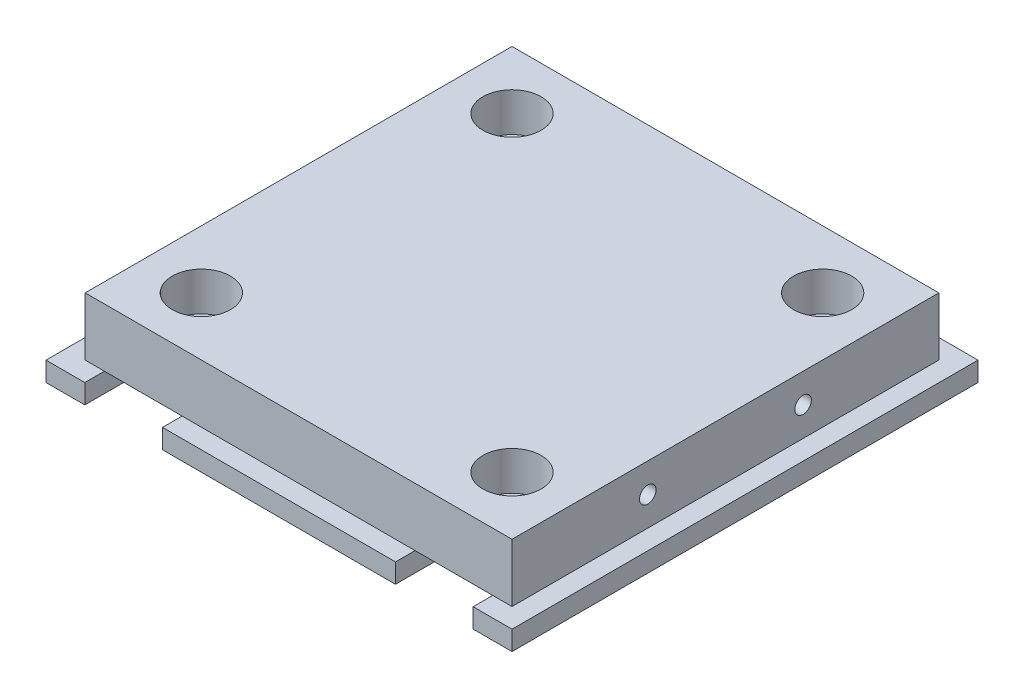
ISO-10303-21;
HEADER;
FILE_DESCRIPTION(('STEP AP214'),'2;1');
FILE_NAME('part.step','',(''),(''),'','','');
FILE_SCHEMA(('AUTOMOTIVE_DESIGN { 1 0 10303 214 1 1 1 1 }'));
ENDSEC;
DATA;
#1=APPLICATION_CONTEXT('core data for automotive mechanical design processes');
#2=APPLICATION_PROTOCOL_DEFINITION('international standard','automotive_design',2000,#1);
#3=PRODUCT_CONTEXT('',#1,'mechanical');
#4=PRODUCT('Part','Part','',(#3));
#5=PRODUCT_RELATED_PRODUCT_CATEGORY('part','',(#4));
#6=PRODUCT_DEFINITION_FORMATION('','',#4);
#7=PRODUCT_DEFINITION_CONTEXT('part definition',#1,'design');
#8=PRODUCT_DEFINITION('design','',#6,#7);
#9=PRODUCT_DEFINITION_SHAPE('','',#8);
#10=(LENGTH_UNIT() NAMED_UNIT(*) SI_UNIT(.MILLI.,.METRE.));
#11=(NAMED_UNIT(*) PLANE_ANGLE_UNIT() SI_UNIT($,.RADIAN.));
#12=(NAMED_UNIT(*) SI_UNIT($,.STERADIAN.) SOLID_ANGLE_UNIT());
#13=UNCERTAINTY_MEASURE_WITH_UNIT(LENGTH_MEASURE(1.E-05),#10,'distance_accuracy_value','');
#14=(GEOMETRIC_REPRESENTATION_CONTEXT(3) GLOBAL_UNCERTAINTY_ASSIGNED_CONTEXT((#13)) GLOBAL_UNIT_ASSIGNED_CONTEXT((#10,
#11,#12)) REPRESENTATION_CONTEXT('',''));
#15=CARTESIAN_POINT('',(0.,0.,0.));
#16=DIRECTION('',(0.,0.,1.));
#17=DIRECTION('',(1.,0.,0.));
#18=AXIS2_PLACEMENT_3D('',#15,#16,#17);
#19=CARTESIAN_POINT('',(-25.4,12.7,25.4));
#20=DIRECTION('',(0.,-1.,0.));
#21=DIRECTION('',(0.,0.,-1.));
#22=AXIS2_PLACEMENT_3D('',#19,#20,#21);
#23=CYLINDRICAL_SURFACE('',#22,2.5527);
#24=CARTESIAN_POINT('',(-25.4,3.175,25.4));
#25=DIRECTION('',(0.,-1.,0.));
#26=DIRECTION('',(0.,0.,-1.));
#27=AXIS2_PLACEMENT_3D('',#24,#25,#26);
#28=CIRCLE('',#27,2.5527);
#29=CARTESIAN_POINT('',(-25.4,3.175,22.8473));
#30=VERTEX_POINT('',#29);
#31=EDGE_CURVE('E286',#30,#30,#28,.T.);
#32=ORIENTED_EDGE('',*,*,#31,.T.);
#33=EDGE_LOOP('',(#32));
#34=FACE_BOUND('',#33,.T.);
#35=CARTESIAN_POINT('',(-25.4,6.35,25.4));
#36=DIRECTION('',(0.,1.,0.));
#37=DIRECTION('',(0.,0.,1.));
#38=AXIS2_PLACEMENT_3D('',#35,#36,#37);
#39=CIRCLE('',#38,2.5527);
#40=CARTESIAN_POINT('',(-25.4,6.35,27.9527));
#41=VERTEX_POINT('',#40);
#42=EDGE_CURVE('E41',#41,#41,#39,.F.);
#43=ORIENTED_EDGE('',*,*,#42,.F.);
#44=EDGE_LOOP('',(#43));
#45=FACE_BOUND('',#44,.T.);
#46=ADVANCED_FACE('F37',(#34,#45),#23,.F.);
#47=CARTESIAN_POINT('',(25.4,12.7,25.4));
#48=DIRECTION('',(0.,-1.,0.));
#49=DIRECTION('',(0.,0.,-1.));
#50=AXIS2_PLACEMENT_3D('',#47,#48,#49);
#51=CYLINDRICAL_SURFACE('',#50,2.5527);
#52=CARTESIAN_POINT('',(25.4,3.175,25.4));
#53=DIRECTION('',(0.,-1.,0.));
#54=DIRECTION('',(0.,0.,-1.));
#55=AXIS2_PLACEMENT_3D('',#52,#53,#54);
#56=CIRCLE('',#55,2.5527);
#57=CARTESIAN_POINT('',(25.4,3.175,22.8473));
#58=VERTEX_POINT('',#57);
#59=EDGE_CURVE('E283',#58,#58,#56,.T.);
#60=ORIENTED_EDGE('',*,*,#59,.T.);
#61=EDGE_LOOP('',(#60));
#62=FACE_BOUND('',#61,.T.);
#63=CARTESIAN_POINT('',(25.4,6.35,25.4));
#64=DIRECTION('',(0.,1.,0.));
#65=DIRECTION('',(0.,0.,1.));
#66=AXIS2_PLACEMENT_3D('',#63,#64,#65);
#67=CIRCLE('',#66,2.5527);
#68=CARTESIAN_POINT('',(25.4,6.35,27.9527));
#69=VERTEX_POINT('',#68);
#70=EDGE_CURVE('E253',#69,#69,#67,.F.);
#71=ORIENTED_EDGE('',*,*,#70,.F.);
#72=EDGE_LOOP('',(#71));
#73=FACE_BOUND('',#72,.T.);
#74=ADVANCED_FACE('F497',(#62,#73),#51,.F.);
#75=CARTESIAN_POINT('',(25.4,12.7,-25.4));
#76=DIRECTION('',(0.,-1.,0.));
#77=DIRECTION('',(0.,0.,-1.));
#78=AXIS2_PLACEMENT_3D('',#75,#76,#77);
#79=CYLINDRICAL_SURFACE('',#78,2.5527);
#80=CARTESIAN_POINT('',(25.4,3.175,-25.4));
#81=DIRECTION('',(0.,-1.,0.));
#82=DIRECTION('',(0.,0.,-1.));
#83=AXIS2_PLACEMENT_3D('',#80,#81,#82);
#84=CIRCLE('',#83,2.5527);
#85=CARTESIAN_POINT('',(25.4,3.175,-27.9527));
#86=VERTEX_POINT('',#85);
#87=EDGE_CURVE('E280',#86,#86,#84,.T.);
#88=ORIENTED_EDGE('',*,*,#87,.T.);
#89=EDGE_LOOP('',(#88));
#90=FACE_BOUND('',#89,.T.);
#91=CARTESIAN_POINT('',(25.4,6.35,-25.4));
#92=DIRECTION('',(0.,1.,0.));
#93=DIRECTION('',(0.,0.,1.));
#94=AXIS2_PLACEMENT_3D('',#91,#92,#93);
#95=CIRCLE('',#94,2.5527);
#96=CARTESIAN_POINT('',(25.4,6.35,-22.8473));
#97=VERTEX_POINT('',#96);
#98=EDGE_CURVE('E249',#97,#97,#95,.F.);
#99=ORIENTED_EDGE('',*,*,#98,.F.);
#100=EDGE_LOOP('',(#99));
#101=FACE_BOUND('',#100,.T.);
#102=ADVANCED_FACE('F503',(#90,#101),#79,.F.);
#103=CARTESIAN_POINT('',(-25.4,12.7,-25.4));
#104=DIRECTION('',(0.,-1.,0.));
#105=DIRECTION('',(0.,0.,-1.));
#106=AXIS2_PLACEMENT_3D('',#103,#104,#105);
#107=CYLINDRICAL_SURFACE('',#106,2.5527);
#108=CARTESIAN_POINT('',(-25.4,3.175,-25.4));
#109=DIRECTION('',(0.,-1.,0.));
#110=DIRECTION('',(0.,0.,-1.));
#111=AXIS2_PLACEMENT_3D('',#108,#109,#110);
#112=CIRCLE('',#111,2.5527);
#113=CARTESIAN_POINT('',(-25.4,3.175,-27.9527));
#114=VERTEX_POINT('',#113);
#115=EDGE_CURVE('E247',#114,#114,#112,.T.);
#116=ORIENTED_EDGE('',*,*,#115,.T.);
#117=EDGE_LOOP('',(#116));
#118=FACE_BOUND('',#117,.T.);
#119=CARTESIAN_POINT('',(-25.4,6.35,-25.4));
#120=DIRECTION('',(0.,1.,0.));
#121=DIRECTION('',(0.,0.,1.));
#122=AXIS2_PLACEMENT_3D('',#119,#120,#121);
#123=CIRCLE('',#122,2.5527);
#124=CARTESIAN_POINT('',(-25.4,6.35,-22.8473));
#125=VERTEX_POINT('',#124);
#126=EDGE_CURVE('E244',#125,#125,#123,.F.);
#127=ORIENTED_EDGE('',*,*,#126,.F.);
#128=EDGE_LOOP('',(#127));
#129=FACE_BOUND('',#128,.T.);
#130=ADVANCED_FACE('F737',(#118,#129),#107,.F.);
#131=CARTESIAN_POINT('',(-38.1,3.175,-38.1));
#132=DIRECTION('',(0.,0.,1.));
#133=DIRECTION('',(1.,0.,0.));
#134=AXIS2_PLACEMENT_3D('',#131,#132,#133);
#135=PLANE('',#134);
#136=DIRECTION('',(0.,-1.,0.));
#137=VECTOR('',#136,1.);
#138=CARTESIAN_POINT('',(31.75,3.175,-38.1));
#139=LINE('',#138,#137);
#140=CARTESIAN_POINT('',(31.75,3.175,-38.1));
#141=VERTEX_POINT('',#140);
#142=CARTESIAN_POINT('',(31.75,0.,-38.1));
#143=VERTEX_POINT('',#142);
#144=EDGE_CURVE('E294',#141,#143,#139,.T.);
#145=ORIENTED_EDGE('',*,*,#144,.F.);
#146=DIRECTION('',(-1.,0.,0.));
#147=VECTOR('',#146,1.);
#148=CARTESIAN_POINT('',(-38.1,3.175,-38.1));
#149=LINE('',#148,#147);
#150=CARTESIAN_POINT('',(38.1,3.175,-38.1));
#151=VERTEX_POINT('',#150);
#152=EDGE_CURVE('E224',#151,#141,#149,.T.);
#153=ORIENTED_EDGE('',*,*,#152,.F.);
#154=DIRECTION('',(0.,-1.,0.));
#155=VECTOR('',#154,1.);
#156=CARTESIAN_POINT('',(38.1,3.175,-38.1));
#157=LINE('',#156,#155);
#158=CARTESIAN_POINT('',(38.1,0.,-38.1));
#159=VERTEX_POINT('',#158);
#160=EDGE_CURVE('E11',#151,#159,#157,.T.);
#161=ORIENTED_EDGE('',*,*,#160,.T.);
#162=DIRECTION('',(-1.,0.,0.));
#163=VECTOR('',#162,1.);
#164=CARTESIAN_POINT('',(-38.1,0.,-38.1));
#165=LINE('',#164,#163);
#166=EDGE_CURVE('E425',#159,#143,#165,.T.);
#167=ORIENTED_EDGE('',*,*,#166,.T.);
#168=EDGE_LOOP('',(#145,#153,#161,#167));
#169=FACE_BOUND('',#168,.T.);
#170=ADVANCED_FACE('F743',(#169),#135,.F.);
#171=CARTESIAN_POINT('',(-38.1,3.175,38.1));
#172=DIRECTION('',(0.,0.,-1.));
#173=DIRECTION('',(-1.,0.,0.));
#174=AXIS2_PLACEMENT_3D('',#171,#172,#173);
#175=PLANE('',#174);
#176=DIRECTION('',(0.,-1.,0.));
#177=VECTOR('',#176,1.);
#178=CARTESIAN_POINT('',(31.75,3.175,38.1));
#179=LINE('',#178,#177);
#180=CARTESIAN_POINT('',(31.75,3.175,38.1));
#181=VERTEX_POINT('',#180);
#182=CARTESIAN_POINT('',(31.75,0.,38.1));
#183=VERTEX_POINT('',#182);
#184=EDGE_CURVE('E189',#181,#183,#179,.T.);
#185=ORIENTED_EDGE('',*,*,#184,.T.);
#186=DIRECTION('',(1.,0.,0.));
#187=VECTOR('',#186,1.);
#188=CARTESIAN_POINT('',(-38.1,0.,38.1));
#189=LINE('',#188,#187);
#190=CARTESIAN_POINT('',(38.1,0.,38.1));
#191=VERTEX_POINT('',#190);
#192=EDGE_CURVE('E429',#183,#191,#189,.T.);
#193=ORIENTED_EDGE('',*,*,#192,.T.);
#194=DIRECTION('',(0.,-1.,0.));
#195=VECTOR('',#194,1.);
#196=CARTESIAN_POINT('',(38.1,3.175,38.1));
#197=LINE('',#196,#195);
#198=CARTESIAN_POINT('',(38.1,3.175,38.1));
#199=VERTEX_POINT('',#198);
#200=EDGE_CURVE('E217',#199,#191,#197,.T.);
#201=ORIENTED_EDGE('',*,*,#200,.F.);
#202=DIRECTION('',(1.,0.,0.));
#203=VECTOR('',#202,1.);
#204=CARTESIAN_POINT('',(-38.1,3.175,38.1));
#205=LINE('',#204,#203);
#206=EDGE_CURVE('E207',#181,#199,#205,.T.);
#207=ORIENTED_EDGE('',*,*,#206,.F.);
#208=EDGE_LOOP('',(#185,#193,#201,#207));
#209=FACE_BOUND('',#208,.T.);
#210=ADVANCED_FACE('F215',(#209),#175,.F.);
#211=CARTESIAN_POINT('',(0.,3.175,0.));
#212=DIRECTION('',(0.,-1.,0.));
#213=DIRECTION('',(0.,0.,-1.));
#214=AXIS2_PLACEMENT_3D('',#211,#212,#213);
#215=PLANE('',#214);
#216=DIRECTION('',(0.,0.,-1.));
#217=VECTOR('',#216,1.);
#218=CARTESIAN_POINT('',(31.75,3.175,0.));
#219=LINE('',#218,#217);
#220=CARTESIAN_POINT('',(31.75,3.175,34.89706));
#221=VERTEX_POINT('',#220);
#222=EDGE_CURVE('E193',#181,#221,#219,.T.);
#223=ORIENTED_EDGE('',*,*,#222,.F.);
#224=ORIENTED_EDGE('',*,*,#206,.T.);
#225=DIRECTION('',(0.,0.,-1.));
#226=VECTOR('',#225,1.);
#227=CARTESIAN_POINT('',(38.1,3.175,38.1));
#228=LINE('',#227,#226);
#229=EDGE_CURVE('E392',#199,#151,#228,.T.);
#230=ORIENTED_EDGE('',*,*,#229,.T.);
#231=ORIENTED_EDGE('',*,*,#152,.T.);
#232=CARTESIAN_POINT('',(31.75,3.175,-34.89706));
#233=VERTEX_POINT('',#232);
#234=EDGE_CURVE('E214',#233,#141,#219,.T.);
#235=ORIENTED_EDGE('',*,*,#234,.F.);
#236=DIRECTION('',(-1.,0.,0.));
#237=VECTOR('',#236,1.);
#238=CARTESIAN_POINT('',(0.,3.175,-34.89706));
#239=LINE('',#238,#237);
#240=CARTESIAN_POINT('',(34.89706,3.175,-34.89706));
#241=VERTEX_POINT('',#240);
#242=EDGE_CURVE('E358',#241,#233,#239,.T.);
#243=ORIENTED_EDGE('',*,*,#242,.F.);
#244=DIRECTION('',(0.,0.,-1.));
#245=VECTOR('',#244,1.);
#246=CARTESIAN_POINT('',(34.89706,3.175,0.));
#247=LINE('',#246,#245);
#248=CARTESIAN_POINT('',(34.89706,3.175,34.89706));
#249=VERTEX_POINT('',#248);
#250=EDGE_CURVE('E370',#249,#241,#247,.T.);
#251=ORIENTED_EDGE('',*,*,#250,.F.);
#252=DIRECTION('',(-1.,0.,0.));
#253=VECTOR('',#252,1.);
#254=CARTESIAN_POINT('',(0.,3.175,34.89706));
#255=LINE('',#254,#253);
#256=EDGE_CURVE('E210',#249,#221,#255,.T.);
#257=ORIENTED_EDGE('',*,*,#256,.T.);
#258=EDGE_LOOP('',(#223,#224,#230,#231,#235,#243,#251,#257));
#259=FACE_BOUND('',#258,.T.);
#260=ADVANCED_FACE('F205',(#259),#215,.F.);
#261=CARTESIAN_POINT('',(-19.05,3.175,38.1));
#262=VERTEX_POINT('',#261);
#263=CARTESIAN_POINT('',(19.05,3.175,38.1));
#264=VERTEX_POINT('',#263);
#265=EDGE_CURVE('E219',#262,#264,#205,.T.);
#266=ORIENTED_EDGE('',*,*,#265,.T.);
#267=DIRECTION('',(0.,0.,-1.));
#268=VECTOR('',#267,1.);
#269=CARTESIAN_POINT('',(19.05,3.175,0.));
#270=LINE('',#269,#268);
#271=CARTESIAN_POINT('',(19.05,3.175,34.89706));
#272=VERTEX_POINT('',#271);
#273=EDGE_CURVE('E201',#264,#272,#270,.T.);
#274=ORIENTED_EDGE('',*,*,#273,.T.);
#275=CARTESIAN_POINT('',(-19.05,3.175,34.89706));
#276=VERTEX_POINT('',#275);
#277=EDGE_CURVE('E371',#272,#276,#255,.T.);
#278=ORIENTED_EDGE('',*,*,#277,.T.);
#279=DIRECTION('',(0.,0.,-1.));
#280=VECTOR('',#279,1.);
#281=CARTESIAN_POINT('',(-19.05,3.175,0.));
#282=LINE('',#281,#280);
#283=EDGE_CURVE('E303',#262,#276,#282,.T.);
#284=ORIENTED_EDGE('',*,*,#283,.F.);
#285=EDGE_LOOP('',(#266,#274,#278,#284));
#286=FACE_BOUND('',#285,.T.);
#287=ADVANCED_FACE('F480',(#286),#215,.F.);
#288=CARTESIAN_POINT('',(0.,0.,0.));
#289=DIRECTION('',(0.,-1.,0.));
#290=DIRECTION('',(0.,0.,-1.));
#291=AXIS2_PLACEMENT_3D('',#288,#289,#290);
#292=PLANE('',#291);
#293=ORIENTED_EDGE('',*,*,#192,.F.);
#294=DIRECTION('',(0.,0.,-1.));
#295=VECTOR('',#294,1.);
#296=CARTESIAN_POINT('',(31.75,0.,0.));
#297=LINE('',#296,#295);
#298=EDGE_CURVE('E196',#183,#143,#297,.T.);
#299=ORIENTED_EDGE('',*,*,#298,.T.);
#300=ORIENTED_EDGE('',*,*,#166,.F.);
#301=DIRECTION('',(0.,0.,-1.));
#302=VECTOR('',#301,1.);
#303=CARTESIAN_POINT('',(38.1,0.,38.1));
#304=LINE('',#303,#302);
#305=EDGE_CURVE('E391',#191,#159,#304,.T.);
#306=ORIENTED_EDGE('',*,*,#305,.F.);
#307=EDGE_LOOP('',(#293,#299,#300,#306));
#308=FACE_BOUND('',#307,.T.);
#309=ADVANCED_FACE('F492',(#308),#292,.T.);
#310=CARTESIAN_POINT('',(19.05,3.175,-38.1));
#311=VERTEX_POINT('',#310);
#312=CARTESIAN_POINT('',(-19.05,3.175,-38.1));
#313=VERTEX_POINT('',#312);
#314=EDGE_CURVE('E396',#311,#313,#149,.T.);
#315=ORIENTED_EDGE('',*,*,#314,.F.);
#316=DIRECTION('',(0.,-1.,0.));
#317=VECTOR('',#316,1.);
#318=CARTESIAN_POINT('',(19.05,3.175,-38.1));
#319=LINE('',#318,#317);
#320=CARTESIAN_POINT('',(19.05,0.,-38.1));
#321=VERTEX_POINT('',#320);
#322=EDGE_CURVE('E297',#311,#321,#319,.T.);
#323=ORIENTED_EDGE('',*,*,#322,.T.);
#324=CARTESIAN_POINT('',(-19.05,0.,-38.1));
#325=VERTEX_POINT('',#324);
#326=EDGE_CURVE('E423',#321,#325,#165,.T.);
#327=ORIENTED_EDGE('',*,*,#326,.T.);
#328=DIRECTION('',(0.,-1.,0.));
#329=VECTOR('',#328,1.);
#330=CARTESIAN_POINT('',(-19.05,3.175,-38.1));
#331=LINE('',#330,#329);
#332=EDGE_CURVE('E316',#313,#325,#331,.T.);
#333=ORIENTED_EDGE('',*,*,#332,.F.);
#334=EDGE_LOOP('',(#315,#323,#327,#333));
#335=FACE_BOUND('',#334,.T.);
#336=ADVANCED_FACE('F446',(#335),#135,.F.);
#337=CARTESIAN_POINT('',(-19.05,0.,38.1));
#338=VERTEX_POINT('',#337);
#339=CARTESIAN_POINT('',(19.05,0.,38.1));
#340=VERTEX_POINT('',#339);
#341=EDGE_CURVE('E430',#338,#340,#189,.T.);
#342=ORIENTED_EDGE('',*,*,#341,.T.);
#343=DIRECTION('',(0.,-1.,0.));
#344=VECTOR('',#343,1.);
#345=CARTESIAN_POINT('',(19.05,3.175,38.1));
#346=LINE('',#345,#344);
#347=EDGE_CURVE('E200',#264,#340,#346,.T.);
#348=ORIENTED_EDGE('',*,*,#347,.F.);
#349=ORIENTED_EDGE('',*,*,#265,.F.);
#350=DIRECTION('',(0.,-1.,0.));
#351=VECTOR('',#350,1.);
#352=CARTESIAN_POINT('',(-19.05,3.175,38.1));
#353=LINE('',#352,#351);
#354=EDGE_CURVE('E311',#262,#338,#353,.T.);
#355=ORIENTED_EDGE('',*,*,#354,.T.);
#356=EDGE_LOOP('',(#342,#348,#349,#355));
#357=FACE_BOUND('',#356,.T.);
#358=ADVANCED_FACE('F435',(#357),#175,.F.);
#359=CARTESIAN_POINT('',(19.05,3.175,-34.89706));
#360=VERTEX_POINT('',#359);
#361=CARTESIAN_POINT('',(-19.05,3.175,-34.89706));
#362=VERTEX_POINT('',#361);
#363=EDGE_CURVE('E378',#360,#362,#239,.T.);
#364=ORIENTED_EDGE('',*,*,#363,.F.);
#365=EDGE_CURVE('E211',#360,#311,#270,.T.);
#366=ORIENTED_EDGE('',*,*,#365,.T.);
#367=ORIENTED_EDGE('',*,*,#314,.T.);
#368=EDGE_CURVE('E308',#362,#313,#282,.T.);
#369=ORIENTED_EDGE('',*,*,#368,.F.);
#370=EDGE_LOOP('',(#364,#366,#367,#369));
#371=FACE_BOUND('',#370,.T.);
#372=ADVANCED_FACE('F452',(#371),#215,.F.);
#373=DIRECTION('',(0.,0.,-1.));
#374=VECTOR('',#373,1.);
#375=CARTESIAN_POINT('',(19.05,0.,0.));
#376=LINE('',#375,#374);
#377=EDGE_CURVE('E292',#340,#321,#376,.T.);
#378=ORIENTED_EDGE('',*,*,#377,.F.);
#379=ORIENTED_EDGE('',*,*,#341,.F.);
#380=DIRECTION('',(0.,0.,-1.));
#381=VECTOR('',#380,1.);
#382=CARTESIAN_POINT('',(-19.05,0.,0.));
#383=LINE('',#382,#381);
#384=EDGE_CURVE('E302',#338,#325,#383,.T.);
#385=ORIENTED_EDGE('',*,*,#384,.T.);
#386=ORIENTED_EDGE('',*,*,#326,.F.);
#387=EDGE_LOOP('',(#378,#379,#385,#386));
#388=FACE_BOUND('',#387,.T.);
#389=ADVANCED_FACE('F439',(#388),#292,.T.);
#390=CARTESIAN_POINT('',(38.1,3.175,38.1));
#391=DIRECTION('',(-1.,0.,0.));
#392=DIRECTION('',(0.,0.,1.));
#393=AXIS2_PLACEMENT_3D('',#390,#391,#392);
#394=PLANE('',#393);
#395=ORIENTED_EDGE('',*,*,#305,.T.);
#396=ORIENTED_EDGE('',*,*,#160,.F.);
#397=ORIENTED_EDGE('',*,*,#229,.F.);
#398=ORIENTED_EDGE('',*,*,#200,.T.);
#399=EDGE_LOOP('',(#395,#396,#397,#398));
#400=FACE_BOUND('',#399,.T.);
#401=ADVANCED_FACE('F39',(#400),#394,.F.);
#402=CARTESIAN_POINT('',(-31.75,3.175,-38.1));
#403=VERTEX_POINT('',#402);
#404=CARTESIAN_POINT('',(-38.1,3.175,-38.1));
#405=VERTEX_POINT('',#404);
#406=EDGE_CURVE('E394',#403,#405,#149,.T.);
#407=ORIENTED_EDGE('',*,*,#406,.F.);
#408=DIRECTION('',(0.,-1.,0.));
#409=VECTOR('',#408,1.);
#410=CARTESIAN_POINT('',(-31.75,3.175,-38.1));
#411=LINE('',#410,#409);
#412=CARTESIAN_POINT('',(-31.75,0.,-38.1));
#413=VERTEX_POINT('',#412);
#414=EDGE_CURVE('E320',#403,#413,#411,.T.);
#415=ORIENTED_EDGE('',*,*,#414,.T.);
#416=CARTESIAN_POINT('',(-38.1,0.,-38.1));
#417=VERTEX_POINT('',#416);
#418=EDGE_CURVE('E408',#413,#417,#165,.T.);
#419=ORIENTED_EDGE('',*,*,#418,.T.);
#420=DIRECTION('',(0.,-1.,0.));
#421=VECTOR('',#420,1.);
#422=CARTESIAN_POINT('',(-38.1,3.175,-38.1));
#423=LINE('',#422,#421);
#424=EDGE_CURVE('E46',#405,#417,#423,.T.);
#425=ORIENTED_EDGE('',*,*,#424,.F.);
#426=EDGE_LOOP('',(#407,#415,#419,#425));
#427=FACE_BOUND('',#426,.T.);
#428=ADVANCED_FACE('F406',(#427),#135,.F.);
#429=CARTESIAN_POINT('',(-38.1,3.175,38.1));
#430=DIRECTION('',(1.,0.,0.));
#431=DIRECTION('',(0.,0.,-1.));
#432=AXIS2_PLACEMENT_3D('',#429,#430,#431);
#433=PLANE('',#432);
#434=DIRECTION('',(0.,0.,1.));
#435=VECTOR('',#434,1.);
#436=CARTESIAN_POINT('',(-38.1,0.,38.1));
#437=LINE('',#436,#435);
#438=CARTESIAN_POINT('',(-38.1,0.,38.1));
#439=VERTEX_POINT('',#438);
#440=EDGE_CURVE('E412',#417,#439,#437,.T.);
#441=ORIENTED_EDGE('',*,*,#440,.T.);
#442=DIRECTION('',(0.,-1.,0.));
#443=VECTOR('',#442,1.);
#444=CARTESIAN_POINT('',(-38.1,3.175,38.1));
#445=LINE('',#444,#443);
#446=CARTESIAN_POINT('',(-38.1,3.175,38.1));
#447=VERTEX_POINT('',#446);
#448=EDGE_CURVE('E231',#447,#439,#445,.T.);
#449=ORIENTED_EDGE('',*,*,#448,.F.);
#450=DIRECTION('',(0.,0.,1.));
#451=VECTOR('',#450,1.);
#452=CARTESIAN_POINT('',(-38.1,3.175,38.1));
#453=LINE('',#452,#451);
#454=EDGE_CURVE('E220',#405,#447,#453,.T.);
#455=ORIENTED_EDGE('',*,*,#454,.F.);
#456=ORIENTED_EDGE('',*,*,#424,.T.);
#457=EDGE_LOOP('',(#441,#449,#455,#456));
#458=FACE_BOUND('',#457,.T.);
#459=ADVANCED_FACE('F411',(#458),#433,.F.);
#460=CARTESIAN_POINT('',(-31.75,0.,38.1));
#461=VERTEX_POINT('',#460);
#462=EDGE_CURVE('E239',#439,#461,#189,.T.);
#463=ORIENTED_EDGE('',*,*,#462,.T.);
#464=DIRECTION('',(0.,-1.,0.));
#465=VECTOR('',#464,1.);
#466=CARTESIAN_POINT('',(-31.75,3.175,38.1));
#467=LINE('',#466,#465);
#468=CARTESIAN_POINT('',(-31.75,3.175,38.1));
#469=VERTEX_POINT('',#468);
#470=EDGE_CURVE('E323',#469,#461,#467,.T.);
#471=ORIENTED_EDGE('',*,*,#470,.F.);
#472=EDGE_CURVE('E222',#447,#469,#205,.T.);
#473=ORIENTED_EDGE('',*,*,#472,.F.);
#474=ORIENTED_EDGE('',*,*,#448,.T.);
#475=EDGE_LOOP('',(#463,#471,#473,#474));
#476=FACE_BOUND('',#475,.T.);
#477=ADVANCED_FACE('F417',(#476),#175,.F.);
#478=ORIENTED_EDGE('',*,*,#472,.T.);
#479=DIRECTION('',(0.,0.,-1.));
#480=VECTOR('',#479,1.);
#481=CARTESIAN_POINT('',(-31.75,3.175,0.));
#482=LINE('',#481,#480);
#483=CARTESIAN_POINT('',(-31.75,3.175,34.89706));
#484=VERTEX_POINT('',#483);
#485=EDGE_CURVE('E309',#469,#484,#482,.T.);
#486=ORIENTED_EDGE('',*,*,#485,.T.);
#487=CARTESIAN_POINT('',(-34.89706,3.175,34.89706));
#488=VERTEX_POINT('',#487);
#489=EDGE_CURVE('E368',#484,#488,#255,.T.);
#490=ORIENTED_EDGE('',*,*,#489,.T.);
#491=DIRECTION('',(0.,0.,-1.));
#492=VECTOR('',#491,1.);
#493=CARTESIAN_POINT('',(-34.89706,3.175,0.));
#494=LINE('',#493,#492);
#495=CARTESIAN_POINT('',(-34.89706,3.175,-34.89706));
#496=VERTEX_POINT('',#495);
#497=EDGE_CURVE('E353',#488,#496,#494,.T.);
#498=ORIENTED_EDGE('',*,*,#497,.T.);
#499=CARTESIAN_POINT('',(-31.75,3.175,-34.89706));
#500=VERTEX_POINT('',#499);
#501=EDGE_CURVE('E374',#500,#496,#239,.T.);
#502=ORIENTED_EDGE('',*,*,#501,.F.);
#503=EDGE_CURVE('E306',#500,#403,#482,.T.);
#504=ORIENTED_EDGE('',*,*,#503,.T.);
#505=ORIENTED_EDGE('',*,*,#406,.T.);
#506=ORIENTED_EDGE('',*,*,#454,.T.);
#507=EDGE_LOOP('',(#478,#486,#490,#498,#502,#504,#505,#506));
#508=FACE_BOUND('',#507,.T.);
#509=ADVANCED_FACE('F401',(#508),#215,.F.);
#510=DIRECTION('',(0.,0.,-1.));
#511=VECTOR('',#510,1.);
#512=CARTESIAN_POINT('',(-31.75,0.,0.));
#513=LINE('',#512,#511);
#514=EDGE_CURVE('E314',#461,#413,#513,.T.);
#515=ORIENTED_EDGE('',*,*,#514,.F.);
#516=ORIENTED_EDGE('',*,*,#462,.F.);
#517=ORIENTED_EDGE('',*,*,#440,.F.);
#518=ORIENTED_EDGE('',*,*,#418,.F.);
#519=EDGE_LOOP('',(#515,#516,#517,#518));
#520=FACE_BOUND('',#519,.T.);
#521=ADVANCED_FACE('F422',(#520),#292,.T.);
#522=CARTESIAN_POINT('',(-34.89706,12.7,0.));
#523=DIRECTION('',(-1.,0.,0.));
#524=DIRECTION('',(0.,0.,1.));
#525=AXIS2_PLACEMENT_3D('',#522,#523,#524);
#526=PLANE('',#525);
#527=CARTESIAN_POINT('',(-34.89706,7.9375,12.7));
#528=DIRECTION('',(-1.,0.,0.));
#529=DIRECTION('',(0.,0.,1.));
#530=AXIS2_PLACEMENT_3D('',#527,#528,#529);
#531=CIRCLE('',#530,1.35255);
#532=CARTESIAN_POINT('',(-34.89706,7.9375,14.05255));
#533=VERTEX_POINT('',#532);
#534=EDGE_CURVE('E329',#533,#533,#531,.T.);
#535=ORIENTED_EDGE('',*,*,#534,.F.);
#536=EDGE_LOOP('',(#535));
#537=FACE_BOUND('',#536,.T.);
#538=CARTESIAN_POINT('',(-34.89706,7.9375,-12.7));
#539=DIRECTION('',(-1.,0.,0.));
#540=DIRECTION('',(0.,0.,1.));
#541=AXIS2_PLACEMENT_3D('',#538,#539,#540);
#542=CIRCLE('',#541,1.35255);
#543=CARTESIAN_POINT('',(-34.89706,7.9375,-11.34745));
#544=VERTEX_POINT('',#543);
#545=EDGE_CURVE('E335',#544,#544,#542,.T.);
#546=ORIENTED_EDGE('',*,*,#545,.F.);
#547=EDGE_LOOP('',(#546));
#548=FACE_BOUND('',#547,.T.);
#549=ORIENTED_EDGE('',*,*,#497,.F.);
#550=DIRECTION('',(0.,-1.,0.));
#551=VECTOR('',#550,1.);
#552=CARTESIAN_POINT('',(-34.89706,12.7,34.89706));
#553=LINE('',#552,#551);
#554=CARTESIAN_POINT('',(-34.89706,12.7,34.89706));
#555=VERTEX_POINT('',#554);
#556=EDGE_CURVE('E388',#555,#488,#553,.T.);
#557=ORIENTED_EDGE('',*,*,#556,.F.);
#558=DIRECTION('',(0.,0.,-1.));
#559=VECTOR('',#558,1.);
#560=CARTESIAN_POINT('',(-34.89706,12.7,0.));
#561=LINE('',#560,#559);
#562=CARTESIAN_POINT('',(-34.89706,12.7,-34.89706));
#563=VERTEX_POINT('',#562);
#564=EDGE_CURVE('E354',#555,#563,#561,.T.);
#565=ORIENTED_EDGE('',*,*,#564,.T.);
#566=DIRECTION('',(0.,-1.,0.));
#567=VECTOR('',#566,1.);
#568=CARTESIAN_POINT('',(-34.89706,12.7,-34.89706));
#569=LINE('',#568,#567);
#570=EDGE_CURVE('E365',#563,#496,#569,.T.);
#571=ORIENTED_EDGE('',*,*,#570,.T.);
#572=EDGE_LOOP('',(#549,#557,#565,#571));
#573=FACE_BOUND('',#572,.T.);
#574=ADVANCED_FACE('F482',(#537,#548,#573),#526,.T.);
#575=CARTESIAN_POINT('',(0.,12.7,34.89706));
#576=DIRECTION('',(0.,0.,1.));
#577=DIRECTION('',(1.,0.,0.));
#578=AXIS2_PLACEMENT_3D('',#575,#576,#577);
#579=PLANE('',#578);
#580=ORIENTED_EDGE('',*,*,#256,.F.);
#581=DIRECTION('',(0.,-1.,0.));
#582=VECTOR('',#581,1.);
#583=CARTESIAN_POINT('',(34.89706,12.7,34.89706));
#584=LINE('',#583,#582);
#585=CARTESIAN_POINT('',(34.89706,12.7,34.89706));
#586=VERTEX_POINT('',#585);
#587=EDGE_CURVE('E385',#586,#249,#584,.T.);
#588=ORIENTED_EDGE('',*,*,#587,.F.);
#589=DIRECTION('',(-1.,0.,0.));
#590=VECTOR('',#589,1.);
#591=CARTESIAN_POINT('',(0.,12.7,34.89706));
#592=LINE('',#591,#590);
#593=EDGE_CURVE('E357',#586,#555,#592,.T.);
#594=ORIENTED_EDGE('',*,*,#593,.T.);
#595=ORIENTED_EDGE('',*,*,#556,.T.);
#596=ORIENTED_EDGE('',*,*,#489,.F.);
#597=DIRECTION('',(1.,0.,0.));
#598=VECTOR('',#597,1.);
#599=CARTESIAN_POINT('',(0.,3.175,34.89706));
#600=LINE('',#599,#598);
#601=EDGE_CURVE('E319',#484,#276,#600,.T.);
#602=ORIENTED_EDGE('',*,*,#601,.T.);
#603=ORIENTED_EDGE('',*,*,#277,.F.);
#604=DIRECTION('',(1.,0.,0.));
#605=VECTOR('',#604,1.);
#606=CARTESIAN_POINT('',(0.,3.175,34.89706));
#607=LINE('',#606,#605);
#608=EDGE_CURVE('E296',#272,#221,#607,.T.);
#609=ORIENTED_EDGE('',*,*,#608,.T.);
#610=EDGE_LOOP('',(#580,#588,#594,#595,#596,#602,#603,#609));
#611=FACE_BOUND('',#610,.T.);
#612=ADVANCED_FACE('F475',(#611),#579,.T.);
#613=CARTESIAN_POINT('',(34.89706,12.7,0.));
#614=DIRECTION('',(-1.,0.,0.));
#615=DIRECTION('',(0.,0.,1.));
#616=AXIS2_PLACEMENT_3D('',#613,#614,#615);
#617=PLANE('',#616);
#618=CARTESIAN_POINT('',(34.89706,7.9375,-12.7));
#619=DIRECTION('',(1.,0.,0.));
#620=DIRECTION('',(0.,0.,-1.));
#621=AXIS2_PLACEMENT_3D('',#618,#619,#620);
#622=CIRCLE('',#621,1.35255);
#623=CARTESIAN_POINT('',(34.89706,7.9375,-14.05255));
#624=VERTEX_POINT('',#623);
#625=EDGE_CURVE('E341',#624,#624,#622,.T.);
#626=ORIENTED_EDGE('',*,*,#625,.F.);
#627=EDGE_LOOP('',(#626));
#628=FACE_BOUND('',#627,.T.);
#629=CARTESIAN_POINT('',(34.89706,7.9375,12.7));
#630=DIRECTION('',(1.,0.,0.));
#631=DIRECTION('',(0.,0.,-1.));
#632=AXIS2_PLACEMENT_3D('',#629,#630,#631);
#633=CIRCLE('',#632,1.35255);
#634=CARTESIAN_POINT('',(34.89706,7.9375,11.34745));
#635=VERTEX_POINT('',#634);
#636=EDGE_CURVE('E347',#635,#635,#633,.T.);
#637=ORIENTED_EDGE('',*,*,#636,.F.);
#638=EDGE_LOOP('',(#637));
#639=FACE_BOUND('',#638,.T.);
#640=ORIENTED_EDGE('',*,*,#250,.T.);
#641=DIRECTION('',(0.,-1.,0.));
#642=VECTOR('',#641,1.);
#643=CARTESIAN_POINT('',(34.89706,12.7,-34.89706));
#644=LINE('',#643,#642);
#645=CARTESIAN_POINT('',(34.89706,12.7,-34.89706));
#646=VERTEX_POINT('',#645);
#647=EDGE_CURVE('E382',#646,#241,#644,.T.);
#648=ORIENTED_EDGE('',*,*,#647,.F.);
#649=DIRECTION('',(0.,0.,-1.));
#650=VECTOR('',#649,1.);
#651=CARTESIAN_POINT('',(34.89706,12.7,0.));
#652=LINE('',#651,#650);
#653=EDGE_CURVE('E361',#586,#646,#652,.T.);
#654=ORIENTED_EDGE('',*,*,#653,.F.);
#655=ORIENTED_EDGE('',*,*,#587,.T.);
#656=EDGE_LOOP('',(#640,#648,#654,#655));
#657=FACE_BOUND('',#656,.T.);
#658=ADVANCED_FACE('F467',(#628,#639,#657),#617,.F.);
#659=CARTESIAN_POINT('',(0.,12.7,-34.89706));
#660=DIRECTION('',(0.,0.,1.));
#661=DIRECTION('',(1.,0.,0.));
#662=AXIS2_PLACEMENT_3D('',#659,#660,#661);
#663=PLANE('',#662);
#664=ORIENTED_EDGE('',*,*,#242,.T.);
#665=EDGE_CURVE('E377',#233,#360,#239,.T.);
#666=ORIENTED_EDGE('',*,*,#665,.T.);
#667=ORIENTED_EDGE('',*,*,#363,.T.);
#668=EDGE_CURVE('E379',#362,#500,#239,.T.);
#669=ORIENTED_EDGE('',*,*,#668,.T.);
#670=ORIENTED_EDGE('',*,*,#501,.T.);
#671=ORIENTED_EDGE('',*,*,#570,.F.);
#672=DIRECTION('',(-1.,0.,0.));
#673=VECTOR('',#672,1.);
#674=CARTESIAN_POINT('',(0.,12.7,-34.89706));
#675=LINE('',#674,#673);
#676=EDGE_CURVE('E363',#646,#563,#675,.T.);
#677=ORIENTED_EDGE('',*,*,#676,.F.);
#678=ORIENTED_EDGE('',*,*,#647,.T.);
#679=EDGE_LOOP('',(#664,#666,#667,#669,#670,#671,#677,#678));
#680=FACE_BOUND('',#679,.T.);
#681=ADVANCED_FACE('F463',(#680),#663,.F.);
#682=CARTESIAN_POINT('',(0.,12.7,0.));
#683=DIRECTION('',(0.,1.,0.));
#684=DIRECTION('',(0.,0.,1.));
#685=AXIS2_PLACEMENT_3D('',#682,#683,#684);
#686=PLANE('',#685);
#687=CARTESIAN_POINT('',(-25.4,12.7,25.4));
#688=DIRECTION('',(0.,1.,0.));
#689=DIRECTION('',(0.,0.,1.));
#690=AXIS2_PLACEMENT_3D('',#687,#688,#689);
#691=CIRCLE('',#690,4.7625);
#692=CARTESIAN_POINT('',(-25.4,12.7,30.1625));
#693=VERTEX_POINT('',#692);
#694=EDGE_CURVE('E269',#693,#693,#691,.T.);
#695=ORIENTED_EDGE('',*,*,#694,.F.);
#696=EDGE_LOOP('',(#695));
#697=FACE_BOUND('',#696,.T.);
#698=CARTESIAN_POINT('',(25.4,12.7,25.4));
#699=DIRECTION('',(0.,1.,0.));
#700=DIRECTION('',(0.,0.,1.));
#701=AXIS2_PLACEMENT_3D('',#698,#699,#700);
#702=CIRCLE('',#701,4.7625);
#703=CARTESIAN_POINT('',(25.4,12.7,30.1625));
#704=VERTEX_POINT('',#703);
#705=EDGE_CURVE('E262',#704,#704,#702,.T.);
#706=ORIENTED_EDGE('',*,*,#705,.F.);
#707=EDGE_LOOP('',(#706));
#708=FACE_BOUND('',#707,.T.);
#709=CARTESIAN_POINT('',(25.4,12.7,-25.4));
#710=DIRECTION('',(0.,1.,0.));
#711=DIRECTION('',(0.,0.,1.));
#712=AXIS2_PLACEMENT_3D('',#709,#710,#711);
#713=CIRCLE('',#712,4.7625);
#714=CARTESIAN_POINT('',(25.4,12.7,-20.6375));
#715=VERTEX_POINT('',#714);
#716=EDGE_CURVE('E255',#715,#715,#713,.T.);
#717=ORIENTED_EDGE('',*,*,#716,.F.);
#718=EDGE_LOOP('',(#717));
#719=FACE_BOUND('',#718,.T.);
#720=CARTESIAN_POINT('',(-25.4,12.7,-25.4));
#721=DIRECTION('',(0.,1.,0.));
#722=DIRECTION('',(0.,0.,1.));
#723=AXIS2_PLACEMENT_3D('',#720,#721,#722);
#724=CIRCLE('',#723,4.7625);
#725=CARTESIAN_POINT('',(-25.4,12.7,-20.6375));
#726=VERTEX_POINT('',#725);
#727=EDGE_CURVE('E251',#726,#726,#724,.T.);
#728=ORIENTED_EDGE('',*,*,#727,.F.);
#729=EDGE_LOOP('',(#728));
#730=FACE_BOUND('',#729,.T.);
#731=ORIENTED_EDGE('',*,*,#564,.F.);
#732=ORIENTED_EDGE('',*,*,#593,.F.);
#733=ORIENTED_EDGE('',*,*,#653,.T.);
#734=ORIENTED_EDGE('',*,*,#676,.T.);
#735=EDGE_LOOP('',(#731,#732,#733,#734));
#736=FACE_BOUND('',#735,.T.);
#737=ADVANCED_FACE('F472',(#697,#708,#719,#730,#736),#686,.T.);
#738=CARTESIAN_POINT('',(23.72106,7.9375,12.7));
#739=DIRECTION('',(1.,0.,0.));
#740=DIRECTION('',(0.,0.,-1.));
#741=AXIS2_PLACEMENT_3D('',#738,#739,#740);
#742=CONICAL_SURFACE('',#741,1.35255,1.02974425867665);
#743=CARTESIAN_POINT('',(22.9083659697343,7.9375,12.7));
#744=VERTEX_POINT('',#743);
#745=VERTEX_LOOP('',#744);
#746=FACE_BOUND('',#745,.T.);
#747=CARTESIAN_POINT('',(23.72106,7.9375,12.7));
#748=DIRECTION('',(1.,0.,0.));
#749=DIRECTION('',(0.,0.,-1.));
#750=AXIS2_PLACEMENT_3D('',#747,#748,#749);
#751=CIRCLE('',#750,1.35255);
#752=CARTESIAN_POINT('',(23.72106,7.9375,11.34745));
#753=VERTEX_POINT('',#752);
#754=EDGE_CURVE('E350',#753,#753,#751,.T.);
#755=ORIENTED_EDGE('',*,*,#754,.T.);
#756=EDGE_LOOP('',(#755));
#757=FACE_BOUND('',#756,.T.);
#758=ADVANCED_FACE('F551',(#746,#757),#742,.F.);
#759=CARTESIAN_POINT('',(34.89706,7.9375,12.7));
#760=DIRECTION('',(1.,0.,0.));
#761=DIRECTION('',(0.,0.,-1.));
#762=AXIS2_PLACEMENT_3D('',#759,#760,#761);
#763=CYLINDRICAL_SURFACE('',#762,1.35255);
#764=ORIENTED_EDGE('',*,*,#754,.F.);
#765=EDGE_LOOP('',(#764));
#766=FACE_BOUND('',#765,.T.);
#767=ORIENTED_EDGE('',*,*,#636,.T.);
#768=EDGE_LOOP('',(#767));
#769=FACE_BOUND('',#768,.T.);
#770=ADVANCED_FACE('F547',(#766,#769),#763,.F.);
#771=CARTESIAN_POINT('',(23.72106,7.9375,-12.7));
#772=DIRECTION('',(1.,0.,0.));
#773=DIRECTION('',(0.,0.,-1.));
#774=AXIS2_PLACEMENT_3D('',#771,#772,#773);
#775=CONICAL_SURFACE('',#774,1.35255,1.02974425867665);
#776=CARTESIAN_POINT('',(22.9083659697343,7.9375,-12.7));
#777=VERTEX_POINT('',#776);
#778=VERTEX_LOOP('',#777);
#779=FACE_BOUND('',#778,.T.);
#780=CARTESIAN_POINT('',(23.72106,7.9375,-12.7));
#781=DIRECTION('',(1.,0.,0.));
#782=DIRECTION('',(0.,0.,-1.));
#783=AXIS2_PLACEMENT_3D('',#780,#781,#782);
#784=CIRCLE('',#783,1.35255);
#785=CARTESIAN_POINT('',(23.72106,7.9375,-14.05255));
#786=VERTEX_POINT('',#785);
#787=EDGE_CURVE('E344',#786,#786,#784,.T.);
#788=ORIENTED_EDGE('',*,*,#787,.T.);
#789=EDGE_LOOP('',(#788));
#790=FACE_BOUND('',#789,.T.);
#791=ADVANCED_FACE('F543',(#779,#790),#775,.F.);
#792=CARTESIAN_POINT('',(34.89706,7.9375,-12.7));
#793=DIRECTION('',(1.,0.,0.));
#794=DIRECTION('',(0.,0.,-1.));
#795=AXIS2_PLACEMENT_3D('',#792,#793,#794);
#796=CYLINDRICAL_SURFACE('',#795,1.35255);
#797=ORIENTED_EDGE('',*,*,#787,.F.);
#798=EDGE_LOOP('',(#797));
#799=FACE_BOUND('',#798,.T.);
#800=ORIENTED_EDGE('',*,*,#625,.T.);
#801=EDGE_LOOP('',(#800));
#802=FACE_BOUND('',#801,.T.);
#803=ADVANCED_FACE('F539',(#799,#802),#796,.F.);
#804=CARTESIAN_POINT('',(-23.72106,7.9375,-12.7));
#805=DIRECTION('',(-1.,0.,0.));
#806=DIRECTION('',(0.,0.,1.));
#807=AXIS2_PLACEMENT_3D('',#804,#805,#806);
#808=CONICAL_SURFACE('',#807,1.35255,1.02974425867665);
#809=CARTESIAN_POINT('',(-22.9083659697343,7.9375,-12.7));
#810=VERTEX_POINT('',#809);
#811=VERTEX_LOOP('',#810);
#812=FACE_BOUND('',#811,.T.);
#813=CARTESIAN_POINT('',(-23.72106,7.9375,-12.7));
#814=DIRECTION('',(-1.,0.,0.));
#815=DIRECTION('',(0.,0.,1.));
#816=AXIS2_PLACEMENT_3D('',#813,#814,#815);
#817=CIRCLE('',#816,1.35255);
#818=CARTESIAN_POINT('',(-23.72106,7.9375,-11.34745));
#819=VERTEX_POINT('',#818);
#820=EDGE_CURVE('E338',#819,#819,#817,.T.);
#821=ORIENTED_EDGE('',*,*,#820,.T.);
#822=EDGE_LOOP('',(#821));
#823=FACE_BOUND('',#822,.T.);
#824=ADVANCED_FACE('F535',(#812,#823),#808,.F.);
#825=CARTESIAN_POINT('',(-34.89706,7.9375,-12.7));
#826=DIRECTION('',(-1.,0.,0.));
#827=DIRECTION('',(0.,0.,1.));
#828=AXIS2_PLACEMENT_3D('',#825,#826,#827);
#829=CYLINDRICAL_SURFACE('',#828,1.35255);
#830=ORIENTED_EDGE('',*,*,#820,.F.);
#831=EDGE_LOOP('',(#830));
#832=FACE_BOUND('',#831,.T.);
#833=ORIENTED_EDGE('',*,*,#545,.T.);
#834=EDGE_LOOP('',(#833));
#835=FACE_BOUND('',#834,.T.);
#836=ADVANCED_FACE('F531',(#832,#835),#829,.F.);
#837=CARTESIAN_POINT('',(-23.72106,7.9375,12.7));
#838=DIRECTION('',(-1.,0.,0.));
#839=DIRECTION('',(0.,0.,1.));
#840=AXIS2_PLACEMENT_3D('',#837,#838,#839);
#841=CONICAL_SURFACE('',#840,1.35255,1.02974425867665);
#842=CARTESIAN_POINT('',(-22.9083659697343,7.9375,12.7));
#843=VERTEX_POINT('',#842);
#844=VERTEX_LOOP('',#843);
#845=FACE_BOUND('',#844,.T.);
#846=CARTESIAN_POINT('',(-23.72106,7.9375,12.7));
#847=DIRECTION('',(-1.,0.,0.));
#848=DIRECTION('',(0.,0.,1.));
#849=AXIS2_PLACEMENT_3D('',#846,#847,#848);
#850=CIRCLE('',#849,1.35255);
#851=CARTESIAN_POINT('',(-23.72106,7.9375,14.05255));
#852=VERTEX_POINT('',#851);
#853=EDGE_CURVE('E332',#852,#852,#850,.T.);
#854=ORIENTED_EDGE('',*,*,#853,.T.);
#855=EDGE_LOOP('',(#854));
#856=FACE_BOUND('',#855,.T.);
#857=ADVANCED_FACE('F527',(#845,#856),#841,.F.);
#858=CARTESIAN_POINT('',(-34.89706,7.9375,12.7));
#859=DIRECTION('',(-1.,0.,0.));
#860=DIRECTION('',(0.,0.,1.));
#861=AXIS2_PLACEMENT_3D('',#858,#859,#860);
#862=CYLINDRICAL_SURFACE('',#861,1.35255);
#863=ORIENTED_EDGE('',*,*,#853,.F.);
#864=EDGE_LOOP('',(#863));
#865=FACE_BOUND('',#864,.T.);
#866=ORIENTED_EDGE('',*,*,#534,.T.);
#867=EDGE_LOOP('',(#866));
#868=FACE_BOUND('',#867,.T.);
#869=ADVANCED_FACE('F519',(#865,#868),#862,.F.);
#870=CARTESIAN_POINT('',(0.,3.175,0.));
#871=DIRECTION('',(0.,-1.,0.));
#872=DIRECTION('',(0.,0.,-1.));
#873=AXIS2_PLACEMENT_3D('',#870,#871,#872);
#874=PLANE('',#873);
#875=ORIENTED_EDGE('',*,*,#115,.F.);
#876=EDGE_LOOP('',(#875));
#877=FACE_BOUND('',#876,.T.);
#878=ORIENTED_EDGE('',*,*,#31,.F.);
#879=EDGE_LOOP('',(#878));
#880=FACE_BOUND('',#879,.T.);
#881=EDGE_CURVE('E62',#484,#500,#482,.T.);
#882=ORIENTED_EDGE('',*,*,#881,.T.);
#883=ORIENTED_EDGE('',*,*,#668,.F.);
#884=EDGE_CURVE('E307',#276,#362,#282,.T.);
#885=ORIENTED_EDGE('',*,*,#884,.F.);
#886=ORIENTED_EDGE('',*,*,#601,.F.);
#887=EDGE_LOOP('',(#882,#883,#885,#886));
#888=FACE_BOUND('',#887,.T.);
#889=ADVANCED_FACE('F458',(#877,#880,#888),#874,.T.);
#890=CARTESIAN_POINT('',(-19.05,3.175,0.));
#891=DIRECTION('',(-1.,0.,0.));
#892=DIRECTION('',(0.,0.,1.));
#893=AXIS2_PLACEMENT_3D('',#890,#891,#892);
#894=PLANE('',#893);
#895=ORIENTED_EDGE('',*,*,#384,.F.);
#896=ORIENTED_EDGE('',*,*,#354,.F.);
#897=ORIENTED_EDGE('',*,*,#283,.T.);
#898=ORIENTED_EDGE('',*,*,#884,.T.);
#899=ORIENTED_EDGE('',*,*,#368,.T.);
#900=ORIENTED_EDGE('',*,*,#332,.T.);
#901=EDGE_LOOP('',(#895,#896,#897,#898,#899,#900));
#902=FACE_BOUND('',#901,.T.);
#903=ADVANCED_FACE('F455',(#902),#894,.T.);
#904=CARTESIAN_POINT('',(-31.75,3.175,0.));
#905=DIRECTION('',(-1.,0.,0.));
#906=DIRECTION('',(0.,0.,1.));
#907=AXIS2_PLACEMENT_3D('',#904,#905,#906);
#908=PLANE('',#907);
#909=ORIENTED_EDGE('',*,*,#514,.T.);
#910=ORIENTED_EDGE('',*,*,#414,.F.);
#911=ORIENTED_EDGE('',*,*,#503,.F.);
#912=ORIENTED_EDGE('',*,*,#881,.F.);
#913=ORIENTED_EDGE('',*,*,#485,.F.);
#914=ORIENTED_EDGE('',*,*,#470,.T.);
#915=EDGE_LOOP('',(#909,#910,#911,#912,#913,#914));
#916=FACE_BOUND('',#915,.T.);
#917=ADVANCED_FACE('F420',(#916),#908,.F.);
#918=CARTESIAN_POINT('',(0.,3.175,0.));
#919=DIRECTION('',(0.,-1.,0.));
#920=DIRECTION('',(0.,0.,-1.));
#921=AXIS2_PLACEMENT_3D('',#918,#919,#920);
#922=PLANE('',#921);
#923=ORIENTED_EDGE('',*,*,#87,.F.);
#924=EDGE_LOOP('',(#923));
#925=FACE_BOUND('',#924,.T.);
#926=ORIENTED_EDGE('',*,*,#59,.F.);
#927=EDGE_LOOP('',(#926));
#928=FACE_BOUND('',#927,.T.);
#929=EDGE_CURVE('E54',#272,#360,#270,.T.);
#930=ORIENTED_EDGE('',*,*,#929,.T.);
#931=ORIENTED_EDGE('',*,*,#665,.F.);
#932=EDGE_CURVE('E212',#221,#233,#219,.T.);
#933=ORIENTED_EDGE('',*,*,#932,.F.);
#934=ORIENTED_EDGE('',*,*,#608,.F.);
#935=EDGE_LOOP('',(#930,#931,#933,#934));
#936=FACE_BOUND('',#935,.T.);
#937=ADVANCED_FACE('F464',(#925,#928,#936),#922,.T.);
#938=CARTESIAN_POINT('',(31.75,3.175,0.));
#939=DIRECTION('',(-1.,0.,0.));
#940=DIRECTION('',(0.,0.,1.));
#941=AXIS2_PLACEMENT_3D('',#938,#939,#940);
#942=PLANE('',#941);
#943=ORIENTED_EDGE('',*,*,#298,.F.);
#944=ORIENTED_EDGE('',*,*,#184,.F.);
#945=ORIENTED_EDGE('',*,*,#222,.T.);
#946=ORIENTED_EDGE('',*,*,#932,.T.);
#947=ORIENTED_EDGE('',*,*,#234,.T.);
#948=ORIENTED_EDGE('',*,*,#144,.T.);
#949=EDGE_LOOP('',(#943,#944,#945,#946,#947,#948));
#950=FACE_BOUND('',#949,.T.);
#951=ADVANCED_FACE('F191',(#950),#942,.T.);
#952=CARTESIAN_POINT('',(19.05,3.175,0.));
#953=DIRECTION('',(-1.,0.,0.));
#954=DIRECTION('',(0.,0.,1.));
#955=AXIS2_PLACEMENT_3D('',#952,#953,#954);
#956=PLANE('',#955);
#957=ORIENTED_EDGE('',*,*,#377,.T.);
#958=ORIENTED_EDGE('',*,*,#322,.F.);
#959=ORIENTED_EDGE('',*,*,#365,.F.);
#960=ORIENTED_EDGE('',*,*,#929,.F.);
#961=ORIENTED_EDGE('',*,*,#273,.F.);
#962=ORIENTED_EDGE('',*,*,#347,.T.);
#963=EDGE_LOOP('',(#957,#958,#959,#960,#961,#962));
#964=FACE_BOUND('',#963,.T.);
#965=ADVANCED_FACE('F442',(#964),#956,.F.);
#966=CARTESIAN_POINT('',(-25.4,6.35,-25.4));
#967=DIRECTION('',(0.,1.,0.));
#968=DIRECTION('',(0.,0.,1.));
#969=AXIS2_PLACEMENT_3D('',#966,#967,#968);
#970=PLANE('',#969);
#971=CARTESIAN_POINT('',(-25.4,6.35,-25.4));
#972=DIRECTION('',(0.,1.,0.));
#973=DIRECTION('',(0.,0.,1.));
#974=AXIS2_PLACEMENT_3D('',#971,#972,#973);
#975=CIRCLE('',#974,4.7625);
#976=CARTESIAN_POINT('',(-25.4,6.35,-20.6375));
#977=VERTEX_POINT('',#976);
#978=EDGE_CURVE('E248',#977,#977,#975,.T.);
#979=ORIENTED_EDGE('',*,*,#978,.T.);
#980=EDGE_LOOP('',(#979));
#981=FACE_BOUND('',#980,.T.);
#982=ORIENTED_EDGE('',*,*,#126,.T.);
#983=EDGE_LOOP('',(#982));
#984=FACE_BOUND('',#983,.T.);
#985=ADVANCED_FACE('F514',(#981,#984),#970,.T.);
#986=CARTESIAN_POINT('',(-25.4,6.35,-25.4));
#987=DIRECTION('',(0.,1.,0.));
#988=DIRECTION('',(0.,0.,1.));
#989=AXIS2_PLACEMENT_3D('',#986,#987,#988);
#990=CYLINDRICAL_SURFACE('',#989,4.7625);
#991=ORIENTED_EDGE('',*,*,#978,.F.);
#992=EDGE_LOOP('',(#991));
#993=FACE_BOUND('',#992,.T.);
#994=ORIENTED_EDGE('',*,*,#727,.T.);
#995=EDGE_LOOP('',(#994));
#996=FACE_BOUND('',#995,.T.);
#997=ADVANCED_FACE('F648',(#993,#996),#990,.F.);
#998=CARTESIAN_POINT('',(25.4,6.35,-25.4));
#999=DIRECTION('',(0.,1.,0.));
#1000=DIRECTION('',(0.,0.,1.));
#1001=AXIS2_PLACEMENT_3D('',#998,#999,#1000);
#1002=PLANE('',#1001);
#1003=CARTESIAN_POINT('',(25.4,6.35,-25.4));
#1004=DIRECTION('',(0.,1.,0.));
#1005=DIRECTION('',(0.,0.,1.));
#1006=AXIS2_PLACEMENT_3D('',#1003,#1004,#1005);
#1007=CIRCLE('',#1006,4.7625);
#1008=CARTESIAN_POINT('',(25.4,6.35,-20.6375));
#1009=VERTEX_POINT('',#1008);
#1010=EDGE_CURVE('E252',#1009,#1009,#1007,.T.);
#1011=ORIENTED_EDGE('',*,*,#1010,.T.);
#1012=EDGE_LOOP('',(#1011));
#1013=FACE_BOUND('',#1012,.T.);
#1014=ORIENTED_EDGE('',*,*,#98,.T.);
#1015=EDGE_LOOP('',(#1014));
#1016=FACE_BOUND('',#1015,.T.);
#1017=ADVANCED_FACE('F656',(#1013,#1016),#1002,.T.);
#1018=CARTESIAN_POINT('',(25.4,6.35,-25.4));
#1019=DIRECTION('',(0.,1.,0.));
#1020=DIRECTION('',(0.,0.,1.));
#1021=AXIS2_PLACEMENT_3D('',#1018,#1019,#1020);
#1022=CYLINDRICAL_SURFACE('',#1021,4.7625);
#1023=ORIENTED_EDGE('',*,*,#1010,.F.);
#1024=EDGE_LOOP('',(#1023));
#1025=FACE_BOUND('',#1024,.T.);
#1026=ORIENTED_EDGE('',*,*,#716,.T.);
#1027=EDGE_LOOP('',(#1026));
#1028=FACE_BOUND('',#1027,.T.);
#1029=ADVANCED_FACE('F664',(#1025,#1028),#1022,.F.);
#1030=CARTESIAN_POINT('',(25.4,6.35,25.4));
#1031=DIRECTION('',(0.,1.,0.));
#1032=DIRECTION('',(0.,0.,1.));
#1033=AXIS2_PLACEMENT_3D('',#1030,#1031,#1032);
#1034=PLANE('',#1033);
#1035=CARTESIAN_POINT('',(25.4,6.35,25.4));
#1036=DIRECTION('',(0.,1.,0.));
#1037=DIRECTION('',(0.,0.,1.));
#1038=AXIS2_PLACEMENT_3D('',#1035,#1036,#1037);
#1039=CIRCLE('',#1038,4.7625);
#1040=CARTESIAN_POINT('',(25.4,6.35,30.1625));
#1041=VERTEX_POINT('',#1040);
#1042=EDGE_CURVE('E256',#1041,#1041,#1039,.T.);
#1043=ORIENTED_EDGE('',*,*,#1042,.T.);
#1044=EDGE_LOOP('',(#1043));
#1045=FACE_BOUND('',#1044,.T.);
#1046=ORIENTED_EDGE('',*,*,#70,.T.);
#1047=EDGE_LOOP('',(#1046));
#1048=FACE_BOUND('',#1047,.T.);
#1049=ADVANCED_FACE('F672',(#1045,#1048),#1034,.T.);
#1050=CARTESIAN_POINT('',(25.4,6.35,25.4));
#1051=DIRECTION('',(0.,1.,0.));
#1052=DIRECTION('',(0.,0.,1.));
#1053=AXIS2_PLACEMENT_3D('',#1050,#1051,#1052);
#1054=CYLINDRICAL_SURFACE('',#1053,4.7625);
#1055=ORIENTED_EDGE('',*,*,#1042,.F.);
#1056=EDGE_LOOP('',(#1055));
#1057=FACE_BOUND('',#1056,.T.);
#1058=ORIENTED_EDGE('',*,*,#705,.T.);
#1059=EDGE_LOOP('',(#1058));
#1060=FACE_BOUND('',#1059,.T.);
#1061=ADVANCED_FACE('F680',(#1057,#1060),#1054,.F.);
#1062=CARTESIAN_POINT('',(-25.4,6.35,25.4));
#1063=DIRECTION('',(0.,1.,0.));
#1064=DIRECTION('',(0.,0.,1.));
#1065=AXIS2_PLACEMENT_3D('',#1062,#1063,#1064);
#1066=PLANE('',#1065);
#1067=CARTESIAN_POINT('',(-25.4,6.35,25.4));
#1068=DIRECTION('',(0.,1.,0.));
#1069=DIRECTION('',(0.,0.,1.));
#1070=AXIS2_PLACEMENT_3D('',#1067,#1068,#1069);
#1071=CIRCLE('',#1070,4.7625);
#1072=CARTESIAN_POINT('',(-25.4,6.35,30.1625));
#1073=VERTEX_POINT('',#1072);
#1074=EDGE_CURVE('E937',#1073,#1073,#1071,.T.);
#1075=ORIENTED_EDGE('',*,*,#1074,.T.);
#1076=EDGE_LOOP('',(#1075));
#1077=FACE_BOUND('',#1076,.T.);
#1078=ORIENTED_EDGE('',*,*,#42,.T.);
#1079=EDGE_LOOP('',(#1078));
#1080=FACE_BOUND('',#1079,.T.);
#1081=ADVANCED_FACE('F687',(#1077,#1080),#1066,.T.);
#1082=CARTESIAN_POINT('',(-25.4,6.35,25.4));
#1083=DIRECTION('',(0.,1.,0.));
#1084=DIRECTION('',(0.,0.,1.));
#1085=AXIS2_PLACEMENT_3D('',#1082,#1083,#1084);
#1086=CYLINDRICAL_SURFACE('',#1085,4.7625);
#1087=ORIENTED_EDGE('',*,*,#1074,.F.);
#1088=EDGE_LOOP('',(#1087));
#1089=FACE_BOUND('',#1088,.T.);
#1090=ORIENTED_EDGE('',*,*,#694,.T.);
#1091=EDGE_LOOP('',(#1090));
#1092=FACE_BOUND('',#1091,.T.);
#1093=ADVANCED_FACE('F695',(#1089,#1092),#1086,.F.);
#1094=CLOSED_SHELL('',(#46,#74,#102,#130,#170,#210,#260,#287,#309,#336,#358,#372,#389,#401,#428,
#459,#477,#509,#521,#574,#612,#658,#681,#737,#758,#770,#791,#803,#824,#836,#857,#869,#889,#903,
#917,#937,#951,#965,#985,#997,#1017,#1029,#1049,#1061,#1081,#1093));
#1095=MANIFOLD_SOLID_BREP('B2',#1094);
#1096=ADVANCED_BREP_SHAPE_REPRESENTATION('',(#18,#1095),#14);
#1097=SHAPE_DEFINITION_REPRESENTATION(#9,#1096);
ENDSEC;
END-ISO-10303-21;
